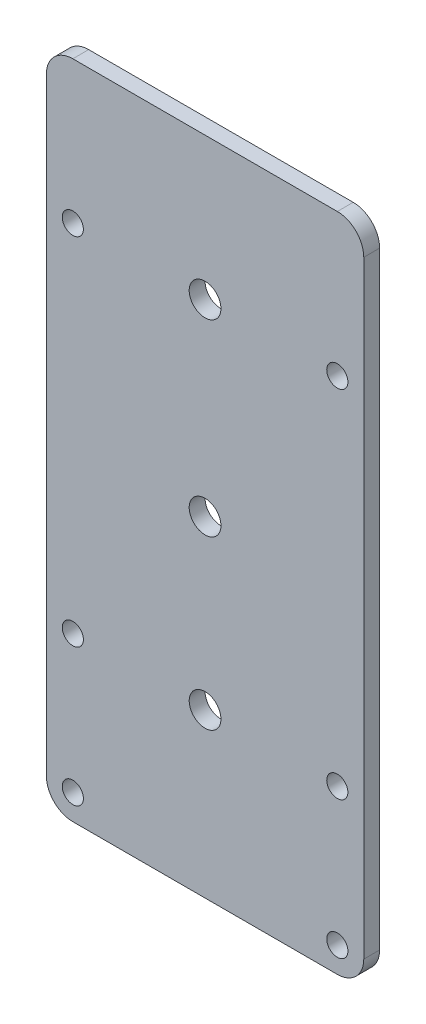
ISO-10303-21;
HEADER;
FILE_DESCRIPTION(('STEP AP214'),'2;1');
FILE_NAME('part.step','',(''),(''),'','','');
FILE_SCHEMA(('AUTOMOTIVE_DESIGN { 1 0 10303 214 1 1 1 1 }'));
ENDSEC;
DATA;
#1=APPLICATION_CONTEXT('core data for automotive mechanical design processes');
#2=APPLICATION_PROTOCOL_DEFINITION('international standard','automotive_design',2000,#1);
#3=PRODUCT_CONTEXT('',#1,'mechanical');
#4=PRODUCT('Part','Part','',(#3));
#5=PRODUCT_RELATED_PRODUCT_CATEGORY('part','',(#4));
#6=PRODUCT_DEFINITION_FORMATION('','',#4);
#7=PRODUCT_DEFINITION_CONTEXT('part definition',#1,'design');
#8=PRODUCT_DEFINITION('design','',#6,#7);
#9=PRODUCT_DEFINITION_SHAPE('','',#8);
#10=(LENGTH_UNIT() NAMED_UNIT(*) SI_UNIT(.MILLI.,.METRE.));
#11=(NAMED_UNIT(*) PLANE_ANGLE_UNIT() SI_UNIT($,.RADIAN.));
#12=(NAMED_UNIT(*) SI_UNIT($,.STERADIAN.) SOLID_ANGLE_UNIT());
#13=UNCERTAINTY_MEASURE_WITH_UNIT(LENGTH_MEASURE(1.E-05),#10,'distance_accuracy_value','');
#14=(GEOMETRIC_REPRESENTATION_CONTEXT(3) GLOBAL_UNCERTAINTY_ASSIGNED_CONTEXT((#13)) GLOBAL_UNIT_ASSIGNED_CONTEXT((#10,
#11,#12)) REPRESENTATION_CONTEXT('',''));
#15=CARTESIAN_POINT('',(0.,0.,0.));
#16=DIRECTION('',(0.,0.,1.));
#17=DIRECTION('',(1.,0.,0.));
#18=AXIS2_PLACEMENT_3D('',#15,#16,#17);
#19=CARTESIAN_POINT('',(-25.,-57.4478818934493,3.));
#20=DIRECTION('',(0.,0.,1.));
#21=DIRECTION('',(1.,0.,0.));
#22=AXIS2_PLACEMENT_3D('',#19,#20,#21);
#23=CYLINDRICAL_SURFACE('',#22,5.);
#24=DIRECTION('',(0.,0.,1.));
#25=VECTOR('',#24,1.);
#26=CARTESIAN_POINT('',(-30.,-57.4478818934493,3.));
#27=LINE('',#26,#25);
#28=CARTESIAN_POINT('',(-30.,-57.4478818934493,0.));
#29=VERTEX_POINT('',#28);
#30=CARTESIAN_POINT('',(-30.,-57.4478818934493,3.));
#31=VERTEX_POINT('',#30);
#32=EDGE_CURVE('E161',#29,#31,#27,.T.);
#33=ORIENTED_EDGE('',*,*,#32,.F.);
#34=CARTESIAN_POINT('',(-25.,-57.4478818934493,0.));
#35=DIRECTION('',(0.,0.,-1.));
#36=DIRECTION('',(-1.,0.,0.));
#37=AXIS2_PLACEMENT_3D('',#34,#35,#36);
#38=CIRCLE('',#37,5.);
#39=CARTESIAN_POINT('',(-25.,-62.4478818934493,0.));
#40=VERTEX_POINT('',#39);
#41=EDGE_CURVE('E44',#40,#29,#38,.T.);
#42=ORIENTED_EDGE('',*,*,#41,.F.);
#43=DIRECTION('',(0.,0.,1.));
#44=VECTOR('',#43,1.);
#45=CARTESIAN_POINT('',(-25.,-62.4478818934493,3.));
#46=LINE('',#45,#44);
#47=CARTESIAN_POINT('',(-25.,-62.4478818934493,3.));
#48=VERTEX_POINT('',#47);
#49=EDGE_CURVE('E163',#48,#40,#46,.F.);
#50=ORIENTED_EDGE('',*,*,#49,.F.);
#51=CARTESIAN_POINT('',(-25.,-57.4478818934493,3.));
#52=DIRECTION('',(0.,0.,-1.));
#53=DIRECTION('',(-1.,0.,0.));
#54=AXIS2_PLACEMENT_3D('',#51,#52,#53);
#55=CIRCLE('',#54,5.);
#56=EDGE_CURVE('E11',#31,#48,#55,.F.);
#57=ORIENTED_EDGE('',*,*,#56,.F.);
#58=EDGE_LOOP('',(#33,#42,#50,#57));
#59=FACE_BOUND('',#58,.T.);
#60=ADVANCED_FACE('F37',(#59),#23,.T.);
#61=CARTESIAN_POINT('',(25.,-57.4478818934493,3.));
#62=DIRECTION('',(0.,0.,1.));
#63=DIRECTION('',(1.,0.,0.));
#64=AXIS2_PLACEMENT_3D('',#61,#62,#63);
#65=CYLINDRICAL_SURFACE('',#64,5.);
#66=DIRECTION('',(0.,0.,1.));
#67=VECTOR('',#66,1.);
#68=CARTESIAN_POINT('',(25.,-62.4478818934493,3.));
#69=LINE('',#68,#67);
#70=CARTESIAN_POINT('',(25.,-62.4478818934493,0.));
#71=VERTEX_POINT('',#70);
#72=CARTESIAN_POINT('',(25.,-62.4478818934493,3.));
#73=VERTEX_POINT('',#72);
#74=EDGE_CURVE('E150',#71,#73,#69,.T.);
#75=ORIENTED_EDGE('',*,*,#74,.F.);
#76=CARTESIAN_POINT('',(25.,-57.4478818934493,0.));
#77=DIRECTION('',(0.,0.,-1.));
#78=DIRECTION('',(-1.,0.,0.));
#79=AXIS2_PLACEMENT_3D('',#76,#77,#78);
#80=CIRCLE('',#79,5.);
#81=CARTESIAN_POINT('',(30.,-57.4478818934493,0.));
#82=VERTEX_POINT('',#81);
#83=EDGE_CURVE('E156',#82,#71,#80,.T.);
#84=ORIENTED_EDGE('',*,*,#83,.F.);
#85=DIRECTION('',(0.,0.,1.));
#86=VECTOR('',#85,1.);
#87=CARTESIAN_POINT('',(30.,-57.4478818934493,3.));
#88=LINE('',#87,#86);
#89=CARTESIAN_POINT('',(30.,-57.4478818934493,3.));
#90=VERTEX_POINT('',#89);
#91=EDGE_CURVE('E153',#90,#82,#88,.F.);
#92=ORIENTED_EDGE('',*,*,#91,.F.);
#93=CARTESIAN_POINT('',(25.,-57.4478818934493,3.));
#94=DIRECTION('',(0.,0.,-1.));
#95=DIRECTION('',(-1.,0.,0.));
#96=AXIS2_PLACEMENT_3D('',#93,#94,#95);
#97=CIRCLE('',#96,5.);
#98=EDGE_CURVE('E159',#73,#90,#97,.F.);
#99=ORIENTED_EDGE('',*,*,#98,.F.);
#100=EDGE_LOOP('',(#75,#84,#92,#99));
#101=FACE_BOUND('',#100,.T.);
#102=ADVANCED_FACE('F173',(#101),#65,.T.);
#103=CARTESIAN_POINT('',(25.,57.4478818934494,3.));
#104=DIRECTION('',(0.,0.,-1.));
#105=DIRECTION('',(-1.,0.,0.));
#106=AXIS2_PLACEMENT_3D('',#103,#104,#105);
#107=CYLINDRICAL_SURFACE('',#106,5.);
#108=DIRECTION('',(0.,0.,-1.));
#109=VECTOR('',#108,1.);
#110=CARTESIAN_POINT('',(25.,62.4478818934494,3.));
#111=LINE('',#110,#109);
#112=CARTESIAN_POINT('',(25.,62.4478818934494,3.));
#113=VERTEX_POINT('',#112);
#114=CARTESIAN_POINT('',(25.,62.4478818934494,0.));
#115=VERTEX_POINT('',#114);
#116=EDGE_CURVE('E110',#113,#115,#111,.T.);
#117=ORIENTED_EDGE('',*,*,#116,.F.);
#118=CARTESIAN_POINT('',(25.,57.4478818934494,3.));
#119=DIRECTION('',(0.,0.,-1.));
#120=DIRECTION('',(-1.,0.,0.));
#121=AXIS2_PLACEMENT_3D('',#118,#119,#120);
#122=CIRCLE('',#121,5.);
#123=CARTESIAN_POINT('',(30.,57.4478818934494,3.));
#124=VERTEX_POINT('',#123);
#125=EDGE_CURVE('E145',#124,#113,#122,.F.);
#126=ORIENTED_EDGE('',*,*,#125,.F.);
#127=DIRECTION('',(0.,0.,-1.));
#128=VECTOR('',#127,1.);
#129=CARTESIAN_POINT('',(30.,57.4478818934494,3.));
#130=LINE('',#129,#128);
#131=CARTESIAN_POINT('',(30.,57.4478818934494,0.));
#132=VERTEX_POINT('',#131);
#133=EDGE_CURVE('E142',#132,#124,#130,.F.);
#134=ORIENTED_EDGE('',*,*,#133,.F.);
#135=CARTESIAN_POINT('',(25.,57.4478818934494,0.));
#136=DIRECTION('',(0.,0.,-1.));
#137=DIRECTION('',(-1.,0.,0.));
#138=AXIS2_PLACEMENT_3D('',#135,#136,#137);
#139=CIRCLE('',#138,5.);
#140=EDGE_CURVE('E147',#115,#132,#139,.T.);
#141=ORIENTED_EDGE('',*,*,#140,.F.);
#142=EDGE_LOOP('',(#117,#126,#134,#141));
#143=FACE_BOUND('',#142,.T.);
#144=ADVANCED_FACE('F249',(#143),#107,.T.);
#145=CARTESIAN_POINT('',(-25.,57.4478818934494,3.));
#146=DIRECTION('',(0.,0.,-1.));
#147=DIRECTION('',(-1.,0.,0.));
#148=AXIS2_PLACEMENT_3D('',#145,#146,#147);
#149=CYLINDRICAL_SURFACE('',#148,5.);
#150=DIRECTION('',(0.,0.,-1.));
#151=VECTOR('',#150,1.);
#152=CARTESIAN_POINT('',(-30.,57.4478818934494,3.));
#153=LINE('',#152,#151);
#154=CARTESIAN_POINT('',(-30.,57.4478818934494,3.));
#155=VERTEX_POINT('',#154);
#156=CARTESIAN_POINT('',(-30.,57.4478818934494,0.));
#157=VERTEX_POINT('',#156);
#158=EDGE_CURVE('E103',#155,#157,#153,.T.);
#159=ORIENTED_EDGE('',*,*,#158,.F.);
#160=CARTESIAN_POINT('',(-25.,57.4478818934494,3.));
#161=DIRECTION('',(0.,0.,-1.));
#162=DIRECTION('',(-1.,0.,0.));
#163=AXIS2_PLACEMENT_3D('',#160,#161,#162);
#164=CIRCLE('',#163,5.);
#165=CARTESIAN_POINT('',(-25.,62.4478818934494,3.));
#166=VERTEX_POINT('',#165);
#167=EDGE_CURVE('E111',#166,#155,#164,.F.);
#168=ORIENTED_EDGE('',*,*,#167,.F.);
#169=DIRECTION('',(0.,0.,-1.));
#170=VECTOR('',#169,1.);
#171=CARTESIAN_POINT('',(-25.,62.4478818934494,3.));
#172=LINE('',#171,#170);
#173=CARTESIAN_POINT('',(-25.,62.4478818934494,0.));
#174=VERTEX_POINT('',#173);
#175=EDGE_CURVE('E106',#174,#166,#172,.F.);
#176=ORIENTED_EDGE('',*,*,#175,.F.);
#177=CARTESIAN_POINT('',(-25.,57.4478818934494,0.));
#178=DIRECTION('',(0.,0.,-1.));
#179=DIRECTION('',(-1.,0.,0.));
#180=AXIS2_PLACEMENT_3D('',#177,#178,#179);
#181=CIRCLE('',#180,5.);
#182=EDGE_CURVE('E99',#157,#174,#181,.T.);
#183=ORIENTED_EDGE('',*,*,#182,.F.);
#184=EDGE_LOOP('',(#159,#168,#176,#183));
#185=FACE_BOUND('',#184,.T.);
#186=ADVANCED_FACE('F101',(#185),#149,.T.);
#187=CARTESIAN_POINT('',(0.,0.,3.));
#188=DIRECTION('',(0.,0.,-1.));
#189=DIRECTION('',(-1.,0.,0.));
#190=AXIS2_PLACEMENT_3D('',#187,#188,#189);
#191=PLANE('',#190);
#192=CARTESIAN_POINT('',(0.,0.,3.));
#193=DIRECTION('',(0.,0.,1.));
#194=DIRECTION('',(1.,0.,0.));
#195=AXIS2_PLACEMENT_3D('',#192,#193,#194);
#196=CIRCLE('',#195,3.);
#197=CARTESIAN_POINT('',(3.,0.,3.));
#198=VERTEX_POINT('',#197);
#199=EDGE_CURVE('E227',#198,#198,#196,.T.);
#200=ORIENTED_EDGE('',*,*,#199,.F.);
#201=EDGE_LOOP('',(#200));
#202=FACE_BOUND('',#201,.T.);
#203=DIRECTION('',(0.,-1.,0.));
#204=VECTOR('',#203,1.);
#205=CARTESIAN_POINT('',(-30.,62.4478818934494,3.));
#206=LINE('',#205,#204);
#207=EDGE_CURVE('E118',#155,#31,#206,.T.);
#208=ORIENTED_EDGE('',*,*,#207,.T.);
#209=ORIENTED_EDGE('',*,*,#56,.T.);
#210=DIRECTION('',(1.,0.,0.));
#211=VECTOR('',#210,1.);
#212=CARTESIAN_POINT('',(30.,-62.4478818934493,3.));
#213=LINE('',#212,#211);
#214=EDGE_CURVE('E167',#48,#73,#213,.T.);
#215=ORIENTED_EDGE('',*,*,#214,.T.);
#216=ORIENTED_EDGE('',*,*,#98,.T.);
#217=DIRECTION('',(0.,1.,0.));
#218=VECTOR('',#217,1.);
#219=CARTESIAN_POINT('',(30.,62.4478818934494,3.));
#220=LINE('',#219,#218);
#221=EDGE_CURVE('E177',#90,#124,#220,.T.);
#222=ORIENTED_EDGE('',*,*,#221,.T.);
#223=ORIENTED_EDGE('',*,*,#125,.T.);
#224=DIRECTION('',(-1.,0.,0.));
#225=VECTOR('',#224,1.);
#226=CARTESIAN_POINT('',(30.,62.4478818934494,3.));
#227=LINE('',#226,#225);
#228=EDGE_CURVE('E119',#113,#166,#227,.T.);
#229=ORIENTED_EDGE('',*,*,#228,.T.);
#230=ORIENTED_EDGE('',*,*,#167,.T.);
#231=EDGE_LOOP('',(#208,#209,#215,#216,#222,#223,#229,#230));
#232=FACE_BOUND('',#231,.T.);
#233=CARTESIAN_POINT('',(-25.,-57.6478818934494,3.));
#234=DIRECTION('',(0.,0.,1.));
#235=DIRECTION('',(1.,0.,0.));
#236=AXIS2_PLACEMENT_3D('',#233,#234,#235);
#237=CIRCLE('',#236,2.);
#238=CARTESIAN_POINT('',(-23.,-57.6478818934494,3.));
#239=VERTEX_POINT('',#238);
#240=EDGE_CURVE('E125',#239,#239,#237,.T.);
#241=ORIENTED_EDGE('',*,*,#240,.F.);
#242=EDGE_LOOP('',(#241));
#243=FACE_BOUND('',#242,.T.);
#244=CARTESIAN_POINT('',(-25.,-31.6478818934493,3.));
#245=DIRECTION('',(0.,0.,1.));
#246=DIRECTION('',(1.,0.,0.));
#247=AXIS2_PLACEMENT_3D('',#244,#245,#246);
#248=CIRCLE('',#247,2.);
#249=CARTESIAN_POINT('',(-23.,-31.6478818934493,3.));
#250=VERTEX_POINT('',#249);
#251=EDGE_CURVE('E183',#250,#250,#248,.T.);
#252=ORIENTED_EDGE('',*,*,#251,.F.);
#253=EDGE_LOOP('',(#252));
#254=FACE_BOUND('',#253,.T.);
#255=CARTESIAN_POINT('',(-25.,35.5321181065507,3.));
#256=DIRECTION('',(0.,0.,1.));
#257=DIRECTION('',(1.,0.,0.));
#258=AXIS2_PLACEMENT_3D('',#255,#256,#257);
#259=CIRCLE('',#258,2.);
#260=CARTESIAN_POINT('',(-23.,35.5321181065507,3.));
#261=VERTEX_POINT('',#260);
#262=EDGE_CURVE('E188',#261,#261,#259,.T.);
#263=ORIENTED_EDGE('',*,*,#262,.F.);
#264=EDGE_LOOP('',(#263));
#265=FACE_BOUND('',#264,.T.);
#266=CARTESIAN_POINT('',(0.,-31.6478818934493,3.));
#267=DIRECTION('',(0.,0.,1.));
#268=DIRECTION('',(1.,0.,0.));
#269=AXIS2_PLACEMENT_3D('',#266,#267,#268);
#270=CIRCLE('',#269,3.);
#271=CARTESIAN_POINT('',(3.,-31.6478818934493,3.));
#272=VERTEX_POINT('',#271);
#273=EDGE_CURVE('E194',#272,#272,#270,.T.);
#274=ORIENTED_EDGE('',*,*,#273,.F.);
#275=EDGE_LOOP('',(#274));
#276=FACE_BOUND('',#275,.T.);
#277=CARTESIAN_POINT('',(0.,35.5321181065507,3.));
#278=DIRECTION('',(0.,0.,1.));
#279=DIRECTION('',(1.,0.,0.));
#280=AXIS2_PLACEMENT_3D('',#277,#278,#279);
#281=CIRCLE('',#280,3.);
#282=CARTESIAN_POINT('',(3.,35.5321181065507,3.));
#283=VERTEX_POINT('',#282);
#284=EDGE_CURVE('E200',#283,#283,#281,.T.);
#285=ORIENTED_EDGE('',*,*,#284,.F.);
#286=EDGE_LOOP('',(#285));
#287=FACE_BOUND('',#286,.T.);
#288=CARTESIAN_POINT('',(25.,35.5321181065507,3.));
#289=DIRECTION('',(0.,0.,1.));
#290=DIRECTION('',(-1.,0.,0.));
#291=AXIS2_PLACEMENT_3D('',#288,#289,#290);
#292=CIRCLE('',#291,2.);
#293=CARTESIAN_POINT('',(23.,35.5321181065507,3.));
#294=VERTEX_POINT('',#293);
#295=EDGE_CURVE('E206',#294,#294,#292,.T.);
#296=ORIENTED_EDGE('',*,*,#295,.F.);
#297=EDGE_LOOP('',(#296));
#298=FACE_BOUND('',#297,.T.);
#299=CARTESIAN_POINT('',(25.,-31.6478818934493,3.));
#300=DIRECTION('',(0.,0.,1.));
#301=DIRECTION('',(-1.,0.,0.));
#302=AXIS2_PLACEMENT_3D('',#299,#300,#301);
#303=CIRCLE('',#302,2.);
#304=CARTESIAN_POINT('',(23.,-31.6478818934493,3.));
#305=VERTEX_POINT('',#304);
#306=EDGE_CURVE('E212',#305,#305,#303,.T.);
#307=ORIENTED_EDGE('',*,*,#306,.F.);
#308=EDGE_LOOP('',(#307));
#309=FACE_BOUND('',#308,.T.);
#310=CARTESIAN_POINT('',(25.,-57.6478818934494,3.));
#311=DIRECTION('',(0.,0.,1.));
#312=DIRECTION('',(-1.,0.,0.));
#313=AXIS2_PLACEMENT_3D('',#310,#311,#312);
#314=CIRCLE('',#313,2.);
#315=CARTESIAN_POINT('',(23.,-57.6478818934494,3.));
#316=VERTEX_POINT('',#315);
#317=EDGE_CURVE('E218',#316,#316,#314,.T.);
#318=ORIENTED_EDGE('',*,*,#317,.F.);
#319=EDGE_LOOP('',(#318));
#320=FACE_BOUND('',#319,.T.);
#321=ADVANCED_FACE('F175',(#202,#232,#243,#254,#265,#276,#287,#298,#309,#320),#191,.F.);
#322=CARTESIAN_POINT('',(0.,0.,0.));
#323=DIRECTION('',(0.,0.,-1.));
#324=DIRECTION('',(-1.,0.,0.));
#325=AXIS2_PLACEMENT_3D('',#322,#323,#324);
#326=PLANE('',#325);
#327=CARTESIAN_POINT('',(0.,0.,0.));
#328=DIRECTION('',(0.,0.,1.));
#329=DIRECTION('',(1.,0.,0.));
#330=AXIS2_PLACEMENT_3D('',#327,#328,#329);
#331=CIRCLE('',#330,3.);
#332=CARTESIAN_POINT('',(3.,0.,0.));
#333=VERTEX_POINT('',#332);
#334=EDGE_CURVE('E224',#333,#333,#331,.T.);
#335=ORIENTED_EDGE('',*,*,#334,.T.);
#336=EDGE_LOOP('',(#335));
#337=FACE_BOUND('',#336,.T.);
#338=CARTESIAN_POINT('',(25.,-31.6478818934493,0.));
#339=DIRECTION('',(0.,0.,1.));
#340=DIRECTION('',(-1.,0.,0.));
#341=AXIS2_PLACEMENT_3D('',#338,#339,#340);
#342=CIRCLE('',#341,2.);
#343=CARTESIAN_POINT('',(23.,-31.6478818934493,0.));
#344=VERTEX_POINT('',#343);
#345=EDGE_CURVE('E215',#344,#344,#342,.T.);
#346=ORIENTED_EDGE('',*,*,#345,.T.);
#347=EDGE_LOOP('',(#346));
#348=FACE_BOUND('',#347,.T.);
#349=CARTESIAN_POINT('',(0.,35.5321181065507,0.));
#350=DIRECTION('',(0.,0.,1.));
#351=DIRECTION('',(1.,0.,0.));
#352=AXIS2_PLACEMENT_3D('',#349,#350,#351);
#353=CIRCLE('',#352,3.);
#354=CARTESIAN_POINT('',(3.,35.5321181065507,0.));
#355=VERTEX_POINT('',#354);
#356=EDGE_CURVE('E203',#355,#355,#353,.T.);
#357=ORIENTED_EDGE('',*,*,#356,.T.);
#358=EDGE_LOOP('',(#357));
#359=FACE_BOUND('',#358,.T.);
#360=CARTESIAN_POINT('',(-25.,35.5321181065507,0.));
#361=DIRECTION('',(0.,0.,1.));
#362=DIRECTION('',(1.,0.,0.));
#363=AXIS2_PLACEMENT_3D('',#360,#361,#362);
#364=CIRCLE('',#363,2.);
#365=CARTESIAN_POINT('',(-23.,35.5321181065507,0.));
#366=VERTEX_POINT('',#365);
#367=EDGE_CURVE('E191',#366,#366,#364,.T.);
#368=ORIENTED_EDGE('',*,*,#367,.T.);
#369=EDGE_LOOP('',(#368));
#370=FACE_BOUND('',#369,.T.);
#371=CARTESIAN_POINT('',(-25.,-57.6478818934494,0.));
#372=DIRECTION('',(0.,0.,1.));
#373=DIRECTION('',(1.,0.,0.));
#374=AXIS2_PLACEMENT_3D('',#371,#372,#373);
#375=CIRCLE('',#374,2.);
#376=CARTESIAN_POINT('',(-23.,-57.6478818934494,0.));
#377=VERTEX_POINT('',#376);
#378=EDGE_CURVE('E130',#377,#377,#375,.T.);
#379=ORIENTED_EDGE('',*,*,#378,.T.);
#380=EDGE_LOOP('',(#379));
#381=FACE_BOUND('',#380,.T.);
#382=DIRECTION('',(1.,0.,0.));
#383=VECTOR('',#382,1.);
#384=CARTESIAN_POINT('',(30.,-62.4478818934493,0.));
#385=LINE('',#384,#383);
#386=EDGE_CURVE('E124',#40,#71,#385,.T.);
#387=ORIENTED_EDGE('',*,*,#386,.F.);
#388=ORIENTED_EDGE('',*,*,#41,.T.);
#389=DIRECTION('',(0.,-1.,0.));
#390=VECTOR('',#389,1.);
#391=CARTESIAN_POINT('',(-30.,62.4478818934494,0.));
#392=LINE('',#391,#390);
#393=EDGE_CURVE('E117',#157,#29,#392,.T.);
#394=ORIENTED_EDGE('',*,*,#393,.F.);
#395=ORIENTED_EDGE('',*,*,#182,.T.);
#396=DIRECTION('',(-1.,0.,0.));
#397=VECTOR('',#396,1.);
#398=CARTESIAN_POINT('',(30.,62.4478818934494,0.));
#399=LINE('',#398,#397);
#400=EDGE_CURVE('E136',#115,#174,#399,.T.);
#401=ORIENTED_EDGE('',*,*,#400,.F.);
#402=ORIENTED_EDGE('',*,*,#140,.T.);
#403=DIRECTION('',(0.,1.,0.));
#404=VECTOR('',#403,1.);
#405=CARTESIAN_POINT('',(30.,62.4478818934494,0.));
#406=LINE('',#405,#404);
#407=EDGE_CURVE('E127',#82,#132,#406,.T.);
#408=ORIENTED_EDGE('',*,*,#407,.F.);
#409=ORIENTED_EDGE('',*,*,#83,.T.);
#410=EDGE_LOOP('',(#387,#388,#394,#395,#401,#402,#408,#409));
#411=FACE_BOUND('',#410,.T.);
#412=CARTESIAN_POINT('',(-25.,-31.6478818934493,0.));
#413=DIRECTION('',(0.,0.,1.));
#414=DIRECTION('',(1.,0.,0.));
#415=AXIS2_PLACEMENT_3D('',#412,#413,#414);
#416=CIRCLE('',#415,2.);
#417=CARTESIAN_POINT('',(-23.,-31.6478818934493,0.));
#418=VERTEX_POINT('',#417);
#419=EDGE_CURVE('E185',#418,#418,#416,.T.);
#420=ORIENTED_EDGE('',*,*,#419,.T.);
#421=EDGE_LOOP('',(#420));
#422=FACE_BOUND('',#421,.T.);
#423=CARTESIAN_POINT('',(0.,-31.6478818934493,0.));
#424=DIRECTION('',(0.,0.,1.));
#425=DIRECTION('',(1.,0.,0.));
#426=AXIS2_PLACEMENT_3D('',#423,#424,#425);
#427=CIRCLE('',#426,3.);
#428=CARTESIAN_POINT('',(3.,-31.6478818934493,0.));
#429=VERTEX_POINT('',#428);
#430=EDGE_CURVE('E197',#429,#429,#427,.T.);
#431=ORIENTED_EDGE('',*,*,#430,.T.);
#432=EDGE_LOOP('',(#431));
#433=FACE_BOUND('',#432,.T.);
#434=CARTESIAN_POINT('',(25.,35.5321181065507,0.));
#435=DIRECTION('',(0.,0.,1.));
#436=DIRECTION('',(-1.,0.,0.));
#437=AXIS2_PLACEMENT_3D('',#434,#435,#436);
#438=CIRCLE('',#437,2.);
#439=CARTESIAN_POINT('',(23.,35.5321181065507,0.));
#440=VERTEX_POINT('',#439);
#441=EDGE_CURVE('E209',#440,#440,#438,.T.);
#442=ORIENTED_EDGE('',*,*,#441,.T.);
#443=EDGE_LOOP('',(#442));
#444=FACE_BOUND('',#443,.T.);
#445=CARTESIAN_POINT('',(25.,-57.6478818934494,0.));
#446=DIRECTION('',(0.,0.,1.));
#447=DIRECTION('',(-1.,0.,0.));
#448=AXIS2_PLACEMENT_3D('',#445,#446,#447);
#449=CIRCLE('',#448,2.);
#450=CARTESIAN_POINT('',(23.,-57.6478818934494,0.));
#451=VERTEX_POINT('',#450);
#452=EDGE_CURVE('E221',#451,#451,#449,.T.);
#453=ORIENTED_EDGE('',*,*,#452,.T.);
#454=EDGE_LOOP('',(#453));
#455=FACE_BOUND('',#454,.T.);
#456=ADVANCED_FACE('F122',(#337,#348,#359,#370,#381,#411,#422,#433,#444,#455),#326,.T.);
#457=CARTESIAN_POINT('',(-30.,62.4478818934494,3.));
#458=DIRECTION('',(1.,0.,0.));
#459=DIRECTION('',(0.,1.,0.));
#460=AXIS2_PLACEMENT_3D('',#457,#458,#459);
#461=PLANE('',#460);
#462=ORIENTED_EDGE('',*,*,#393,.T.);
#463=ORIENTED_EDGE('',*,*,#32,.T.);
#464=ORIENTED_EDGE('',*,*,#207,.F.);
#465=ORIENTED_EDGE('',*,*,#158,.T.);
#466=EDGE_LOOP('',(#462,#463,#464,#465));
#467=FACE_BOUND('',#466,.T.);
#468=ADVANCED_FACE('F115',(#467),#461,.F.);
#469=CARTESIAN_POINT('',(30.,-62.4478818934493,3.));
#470=DIRECTION('',(0.,1.,0.));
#471=DIRECTION('',(0.,0.,1.));
#472=AXIS2_PLACEMENT_3D('',#469,#470,#471);
#473=PLANE('',#472);
#474=ORIENTED_EDGE('',*,*,#214,.F.);
#475=ORIENTED_EDGE('',*,*,#49,.T.);
#476=ORIENTED_EDGE('',*,*,#386,.T.);
#477=ORIENTED_EDGE('',*,*,#74,.T.);
#478=EDGE_LOOP('',(#474,#475,#476,#477));
#479=FACE_BOUND('',#478,.T.);
#480=ADVANCED_FACE('F166',(#479),#473,.F.);
#481=CARTESIAN_POINT('',(30.,62.4478818934494,3.));
#482=DIRECTION('',(-1.,0.,0.));
#483=DIRECTION('',(0.,-1.,0.));
#484=AXIS2_PLACEMENT_3D('',#481,#482,#483);
#485=PLANE('',#484);
#486=ORIENTED_EDGE('',*,*,#221,.F.);
#487=ORIENTED_EDGE('',*,*,#91,.T.);
#488=ORIENTED_EDGE('',*,*,#407,.T.);
#489=ORIENTED_EDGE('',*,*,#133,.T.);
#490=EDGE_LOOP('',(#486,#487,#488,#489));
#491=FACE_BOUND('',#490,.T.);
#492=ADVANCED_FACE('F263',(#491),#485,.F.);
#493=CARTESIAN_POINT('',(30.,62.4478818934494,3.));
#494=DIRECTION('',(0.,-1.,0.));
#495=DIRECTION('',(0.,0.,-1.));
#496=AXIS2_PLACEMENT_3D('',#493,#494,#495);
#497=PLANE('',#496);
#498=ORIENTED_EDGE('',*,*,#228,.F.);
#499=ORIENTED_EDGE('',*,*,#116,.T.);
#500=ORIENTED_EDGE('',*,*,#400,.T.);
#501=ORIENTED_EDGE('',*,*,#175,.T.);
#502=EDGE_LOOP('',(#498,#499,#500,#501));
#503=FACE_BOUND('',#502,.T.);
#504=ADVANCED_FACE('F258',(#503),#497,.F.);
#505=CARTESIAN_POINT('',(-25.,-57.6478818934494,3.));
#506=DIRECTION('',(0.,0.,-1.));
#507=DIRECTION('',(-1.,0.,0.));
#508=AXIS2_PLACEMENT_3D('',#505,#506,#507);
#509=CYLINDRICAL_SURFACE('',#508,2.);
#510=ORIENTED_EDGE('',*,*,#240,.T.);
#511=EDGE_LOOP('',(#510));
#512=FACE_BOUND('',#511,.T.);
#513=ORIENTED_EDGE('',*,*,#378,.F.);
#514=EDGE_LOOP('',(#513));
#515=FACE_BOUND('',#514,.T.);
#516=ADVANCED_FACE('F270',(#512,#515),#509,.F.);
#517=CARTESIAN_POINT('',(-25.,-31.6478818934493,3.));
#518=DIRECTION('',(0.,0.,-1.));
#519=DIRECTION('',(-1.,0.,0.));
#520=AXIS2_PLACEMENT_3D('',#517,#518,#519);
#521=CYLINDRICAL_SURFACE('',#520,2.);
#522=ORIENTED_EDGE('',*,*,#251,.T.);
#523=EDGE_LOOP('',(#522));
#524=FACE_BOUND('',#523,.T.);
#525=ORIENTED_EDGE('',*,*,#419,.F.);
#526=EDGE_LOOP('',(#525));
#527=FACE_BOUND('',#526,.T.);
#528=ADVANCED_FACE('F345',(#524,#527),#521,.F.);
#529=CARTESIAN_POINT('',(-25.,35.5321181065507,3.));
#530=DIRECTION('',(0.,0.,-1.));
#531=DIRECTION('',(-1.,0.,0.));
#532=AXIS2_PLACEMENT_3D('',#529,#530,#531);
#533=CYLINDRICAL_SURFACE('',#532,2.);
#534=ORIENTED_EDGE('',*,*,#262,.T.);
#535=EDGE_LOOP('',(#534));
#536=FACE_BOUND('',#535,.T.);
#537=ORIENTED_EDGE('',*,*,#367,.F.);
#538=EDGE_LOOP('',(#537));
#539=FACE_BOUND('',#538,.T.);
#540=ADVANCED_FACE('F335',(#536,#539),#533,.F.);
#541=CARTESIAN_POINT('',(0.,-31.6478818934493,3.));
#542=DIRECTION('',(0.,0.,-1.));
#543=DIRECTION('',(-1.,0.,0.));
#544=AXIS2_PLACEMENT_3D('',#541,#542,#543);
#545=CYLINDRICAL_SURFACE('',#544,3.);
#546=ORIENTED_EDGE('',*,*,#273,.T.);
#547=EDGE_LOOP('',(#546));
#548=FACE_BOUND('',#547,.T.);
#549=ORIENTED_EDGE('',*,*,#430,.F.);
#550=EDGE_LOOP('',(#549));
#551=FACE_BOUND('',#550,.T.);
#552=ADVANCED_FACE('F325',(#548,#551),#545,.F.);
#553=CARTESIAN_POINT('',(0.,35.5321181065507,3.));
#554=DIRECTION('',(0.,0.,-1.));
#555=DIRECTION('',(-1.,0.,0.));
#556=AXIS2_PLACEMENT_3D('',#553,#554,#555);
#557=CYLINDRICAL_SURFACE('',#556,3.);
#558=ORIENTED_EDGE('',*,*,#284,.T.);
#559=EDGE_LOOP('',(#558));
#560=FACE_BOUND('',#559,.T.);
#561=ORIENTED_EDGE('',*,*,#356,.F.);
#562=EDGE_LOOP('',(#561));
#563=FACE_BOUND('',#562,.T.);
#564=ADVANCED_FACE('F315',(#560,#563),#557,.F.);
#565=CARTESIAN_POINT('',(25.,35.5321181065507,3.));
#566=DIRECTION('',(0.,0.,-1.));
#567=DIRECTION('',(-1.,0.,0.));
#568=AXIS2_PLACEMENT_3D('',#565,#566,#567);
#569=CYLINDRICAL_SURFACE('',#568,2.);
#570=ORIENTED_EDGE('',*,*,#295,.T.);
#571=EDGE_LOOP('',(#570));
#572=FACE_BOUND('',#571,.T.);
#573=ORIENTED_EDGE('',*,*,#441,.F.);
#574=EDGE_LOOP('',(#573));
#575=FACE_BOUND('',#574,.T.);
#576=ADVANCED_FACE('F305',(#572,#575),#569,.F.);
#577=CARTESIAN_POINT('',(25.,-31.6478818934493,3.));
#578=DIRECTION('',(0.,0.,-1.));
#579=DIRECTION('',(-1.,0.,0.));
#580=AXIS2_PLACEMENT_3D('',#577,#578,#579);
#581=CYLINDRICAL_SURFACE('',#580,2.);
#582=ORIENTED_EDGE('',*,*,#306,.T.);
#583=EDGE_LOOP('',(#582));
#584=FACE_BOUND('',#583,.T.);
#585=ORIENTED_EDGE('',*,*,#345,.F.);
#586=EDGE_LOOP('',(#585));
#587=FACE_BOUND('',#586,.T.);
#588=ADVANCED_FACE('F295',(#584,#587),#581,.F.);
#589=CARTESIAN_POINT('',(25.,-57.6478818934494,3.));
#590=DIRECTION('',(0.,0.,-1.));
#591=DIRECTION('',(-1.,0.,0.));
#592=AXIS2_PLACEMENT_3D('',#589,#590,#591);
#593=CYLINDRICAL_SURFACE('',#592,2.);
#594=ORIENTED_EDGE('',*,*,#317,.T.);
#595=EDGE_LOOP('',(#594));
#596=FACE_BOUND('',#595,.T.);
#597=ORIENTED_EDGE('',*,*,#452,.F.);
#598=EDGE_LOOP('',(#597));
#599=FACE_BOUND('',#598,.T.);
#600=ADVANCED_FACE('F238',(#596,#599),#593,.F.);
#601=CARTESIAN_POINT('',(0.,0.,0.));
#602=DIRECTION('',(0.,0.,1.));
#603=DIRECTION('',(1.,0.,0.));
#604=AXIS2_PLACEMENT_3D('',#601,#602,#603);
#605=CYLINDRICAL_SURFACE('',#604,3.);
#606=ORIENTED_EDGE('',*,*,#334,.F.);
#607=EDGE_LOOP('',(#606));
#608=FACE_BOUND('',#607,.T.);
#609=ORIENTED_EDGE('',*,*,#199,.T.);
#610=EDGE_LOOP('',(#609));
#611=FACE_BOUND('',#610,.T.);
#612=ADVANCED_FACE('F235',(#608,#611),#605,.F.);
#613=CLOSED_SHELL('',(#60,#102,#144,#186,#321,#456,#468,#480,#492,#504,#516,#528,#540,#552,#564,
#576,#588,#600,#612));
#614=MANIFOLD_SOLID_BREP('B2',#613);
#615=ADVANCED_BREP_SHAPE_REPRESENTATION('',(#18,#614),#14);
#616=SHAPE_DEFINITION_REPRESENTATION(#9,#615);
ENDSEC;
END-ISO-10303-21;
